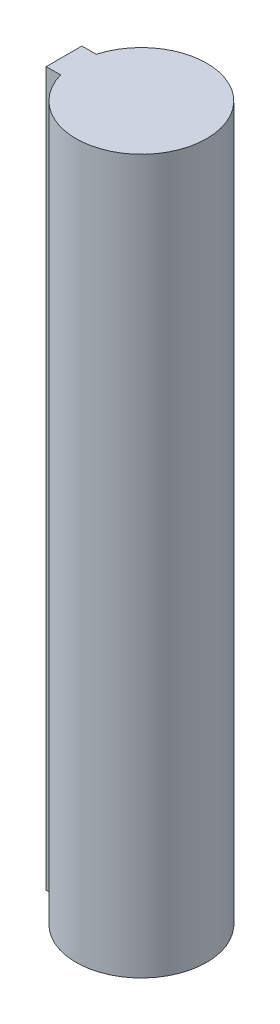
ISO-10303-21;
HEADER;
FILE_DESCRIPTION(('STEP AP214'),'2;1');
FILE_NAME('part.step','',(''),(''),'','','');
FILE_SCHEMA(('AUTOMOTIVE_DESIGN { 1 0 10303 214 1 1 1 1 }'));
ENDSEC;
DATA;
#1=APPLICATION_CONTEXT('core data for automotive mechanical design processes');
#2=APPLICATION_PROTOCOL_DEFINITION('international standard','automotive_design',2000,#1);
#3=PRODUCT_CONTEXT('',#1,'mechanical');
#4=PRODUCT('Part','Part','',(#3));
#5=PRODUCT_RELATED_PRODUCT_CATEGORY('part','',(#4));
#6=PRODUCT_DEFINITION_FORMATION('','',#4);
#7=PRODUCT_DEFINITION_CONTEXT('part definition',#1,'design');
#8=PRODUCT_DEFINITION('design','',#6,#7);
#9=PRODUCT_DEFINITION_SHAPE('','',#8);
#10=(LENGTH_UNIT() NAMED_UNIT(*) SI_UNIT(.MILLI.,.METRE.));
#11=(NAMED_UNIT(*) PLANE_ANGLE_UNIT() SI_UNIT($,.RADIAN.));
#12=(NAMED_UNIT(*) SI_UNIT($,.STERADIAN.) SOLID_ANGLE_UNIT());
#13=UNCERTAINTY_MEASURE_WITH_UNIT(LENGTH_MEASURE(1.E-05),#10,'distance_accuracy_value','');
#14=(GEOMETRIC_REPRESENTATION_CONTEXT(3) GLOBAL_UNCERTAINTY_ASSIGNED_CONTEXT((#13)) GLOBAL_UNIT_ASSIGNED_CONTEXT((#10,
#11,#12)) REPRESENTATION_CONTEXT('',''));
#15=CARTESIAN_POINT('',(0.,0.,0.));
#16=DIRECTION('',(0.,0.,1.));
#17=DIRECTION('',(1.,0.,0.));
#18=AXIS2_PLACEMENT_3D('',#15,#16,#17);
#19=CARTESIAN_POINT('',(0.,60.,0.));
#20=DIRECTION('',(0.,-1.,0.));
#21=DIRECTION('',(0.,0.,-1.));
#22=AXIS2_PLACEMENT_3D('',#19,#20,#21);
#23=CYLINDRICAL_SURFACE('',#22,5.5);
#24=CARTESIAN_POINT('',(0.,0.,0.));
#25=DIRECTION('',(0.,1.,0.));
#26=DIRECTION('',(0.,0.,1.));
#27=AXIS2_PLACEMENT_3D('',#24,#25,#26);
#28=CIRCLE('',#27,5.5);
#29=CARTESIAN_POINT('',(-5.29150262212918,0.,1.5));
#30=VERTEX_POINT('',#29);
#31=CARTESIAN_POINT('',(-5.29150262212918,0.,-1.5));
#32=VERTEX_POINT('',#31);
#33=EDGE_CURVE('E117',#30,#32,#28,.T.);
#34=ORIENTED_EDGE('',*,*,#33,.T.);
#35=DIRECTION('',(0.,-1.,0.));
#36=VECTOR('',#35,1.);
#37=CARTESIAN_POINT('',(-5.29150262212918,60.,-1.5));
#38=LINE('',#37,#36);
#39=CARTESIAN_POINT('',(-5.29150262212918,60.,-1.5));
#40=VERTEX_POINT('',#39);
#41=EDGE_CURVE('E11',#40,#32,#38,.T.);
#42=ORIENTED_EDGE('',*,*,#41,.F.);
#43=CARTESIAN_POINT('',(0.,60.,0.));
#44=DIRECTION('',(0.,1.,0.));
#45=DIRECTION('',(0.,0.,1.));
#46=AXIS2_PLACEMENT_3D('',#43,#44,#45);
#47=CIRCLE('',#46,5.5);
#48=CARTESIAN_POINT('',(-5.29150262212918,60.,1.5));
#49=VERTEX_POINT('',#48);
#50=EDGE_CURVE('E99',#49,#40,#47,.T.);
#51=ORIENTED_EDGE('',*,*,#50,.F.);
#52=DIRECTION('',(0.,-1.,0.));
#53=VECTOR('',#52,1.);
#54=CARTESIAN_POINT('',(-5.29150262212918,60.,1.5));
#55=LINE('',#54,#53);
#56=EDGE_CURVE('E113',#49,#30,#55,.T.);
#57=ORIENTED_EDGE('',*,*,#56,.T.);
#58=EDGE_LOOP('',(#34,#42,#51,#57));
#59=FACE_BOUND('',#58,.T.);
#60=ADVANCED_FACE('F47',(#59),#23,.T.);
#61=CARTESIAN_POINT('',(-6.5,60.,-1.5));
#62=DIRECTION('',(0.,0.,1.));
#63=DIRECTION('',(1.,0.,0.));
#64=AXIS2_PLACEMENT_3D('',#61,#62,#63);
#65=PLANE('',#64);
#66=DIRECTION('',(-1.,0.,0.));
#67=VECTOR('',#66,1.);
#68=CARTESIAN_POINT('',(-6.5,0.,-1.5));
#69=LINE('',#68,#67);
#70=CARTESIAN_POINT('',(-6.5,0.,-1.5));
#71=VERTEX_POINT('',#70);
#72=EDGE_CURVE('E104',#32,#71,#69,.T.);
#73=ORIENTED_EDGE('',*,*,#72,.T.);
#74=DIRECTION('',(0.,-1.,0.));
#75=VECTOR('',#74,1.);
#76=CARTESIAN_POINT('',(-6.5,60.,-1.5));
#77=LINE('',#76,#75);
#78=CARTESIAN_POINT('',(-6.5,60.,-1.5));
#79=VERTEX_POINT('',#78);
#80=EDGE_CURVE('E56',#79,#71,#77,.T.);
#81=ORIENTED_EDGE('',*,*,#80,.F.);
#82=DIRECTION('',(-1.,0.,0.));
#83=VECTOR('',#82,1.);
#84=CARTESIAN_POINT('',(-6.5,60.,-1.5));
#85=LINE('',#84,#83);
#86=EDGE_CURVE('E94',#40,#79,#85,.T.);
#87=ORIENTED_EDGE('',*,*,#86,.F.);
#88=ORIENTED_EDGE('',*,*,#41,.T.);
#89=EDGE_LOOP('',(#73,#81,#87,#88));
#90=FACE_BOUND('',#89,.T.);
#91=ADVANCED_FACE('F103',(#90),#65,.F.);
#92=CARTESIAN_POINT('',(-6.5,60.,-1.5));
#93=DIRECTION('',(1.,0.,0.));
#94=DIRECTION('',(0.,0.,-1.));
#95=AXIS2_PLACEMENT_3D('',#92,#93,#94);
#96=PLANE('',#95);
#97=DIRECTION('',(0.,0.,1.));
#98=VECTOR('',#97,1.);
#99=CARTESIAN_POINT('',(-6.5,0.,-1.5));
#100=LINE('',#99,#98);
#101=CARTESIAN_POINT('',(-6.5,0.,1.5));
#102=VERTEX_POINT('',#101);
#103=EDGE_CURVE('E81',#71,#102,#100,.T.);
#104=ORIENTED_EDGE('',*,*,#103,.T.);
#105=DIRECTION('',(0.,-1.,0.));
#106=VECTOR('',#105,1.);
#107=CARTESIAN_POINT('',(-6.5,60.,1.5));
#108=LINE('',#107,#106);
#109=CARTESIAN_POINT('',(-6.5,60.,1.5));
#110=VERTEX_POINT('',#109);
#111=EDGE_CURVE('E106',#110,#102,#108,.T.);
#112=ORIENTED_EDGE('',*,*,#111,.F.);
#113=DIRECTION('',(0.,0.,1.));
#114=VECTOR('',#113,1.);
#115=CARTESIAN_POINT('',(-6.5,60.,-1.5));
#116=LINE('',#115,#114);
#117=EDGE_CURVE('E97',#79,#110,#116,.T.);
#118=ORIENTED_EDGE('',*,*,#117,.F.);
#119=ORIENTED_EDGE('',*,*,#80,.T.);
#120=EDGE_LOOP('',(#104,#112,#118,#119));
#121=FACE_BOUND('',#120,.T.);
#122=ADVANCED_FACE('F107',(#121),#96,.F.);
#123=CARTESIAN_POINT('',(-6.5,60.,1.5));
#124=DIRECTION('',(0.,0.,-1.));
#125=DIRECTION('',(-1.,0.,0.));
#126=AXIS2_PLACEMENT_3D('',#123,#124,#125);
#127=PLANE('',#126);
#128=DIRECTION('',(1.,0.,0.));
#129=VECTOR('',#128,1.);
#130=CARTESIAN_POINT('',(-6.5,0.,1.5));
#131=LINE('',#130,#129);
#132=EDGE_CURVE('E87',#102,#30,#131,.T.);
#133=ORIENTED_EDGE('',*,*,#132,.T.);
#134=ORIENTED_EDGE('',*,*,#56,.F.);
#135=DIRECTION('',(1.,0.,0.));
#136=VECTOR('',#135,1.);
#137=CARTESIAN_POINT('',(-6.5,60.,1.5));
#138=LINE('',#137,#136);
#139=EDGE_CURVE('E64',#110,#49,#138,.T.);
#140=ORIENTED_EDGE('',*,*,#139,.F.);
#141=ORIENTED_EDGE('',*,*,#111,.T.);
#142=EDGE_LOOP('',(#133,#134,#140,#141));
#143=FACE_BOUND('',#142,.T.);
#144=ADVANCED_FACE('F130',(#143),#127,.F.);
#145=CARTESIAN_POINT('',(0.,60.,0.));
#146=DIRECTION('',(0.,1.,0.));
#147=DIRECTION('',(0.,0.,1.));
#148=AXIS2_PLACEMENT_3D('',#145,#146,#147);
#149=PLANE('',#148);
#150=ORIENTED_EDGE('',*,*,#50,.T.);
#151=ORIENTED_EDGE('',*,*,#86,.T.);
#152=ORIENTED_EDGE('',*,*,#117,.T.);
#153=ORIENTED_EDGE('',*,*,#139,.T.);
#154=EDGE_LOOP('',(#150,#151,#152,#153));
#155=FACE_BOUND('',#154,.T.);
#156=ADVANCED_FACE('F95',(#155),#149,.T.);
#157=CARTESIAN_POINT('',(0.,0.,0.));
#158=DIRECTION('',(0.,1.,0.));
#159=DIRECTION('',(0.,0.,1.));
#160=AXIS2_PLACEMENT_3D('',#157,#158,#159);
#161=PLANE('',#160);
#162=ORIENTED_EDGE('',*,*,#33,.F.);
#163=ORIENTED_EDGE('',*,*,#132,.F.);
#164=ORIENTED_EDGE('',*,*,#103,.F.);
#165=ORIENTED_EDGE('',*,*,#72,.F.);
#166=EDGE_LOOP('',(#162,#163,#164,#165));
#167=FACE_BOUND('',#166,.T.);
#168=ADVANCED_FACE('F133',(#167),#161,.F.);
#169=CLOSED_SHELL('',(#60,#91,#122,#144,#156,#168));
#170=MANIFOLD_SOLID_BREP('B2',#169);
#171=ADVANCED_BREP_SHAPE_REPRESENTATION('',(#18,#170),#14);
#172=SHAPE_DEFINITION_REPRESENTATION(#9,#171);
ENDSEC;
END-ISO-10303-21;
